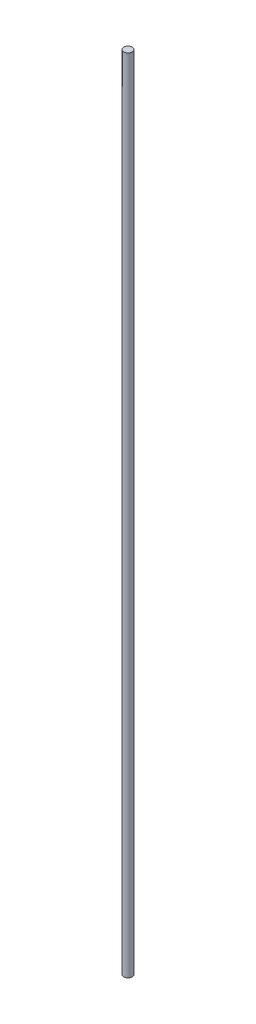
ISO-10303-21;
HEADER;
FILE_DESCRIPTION(('STEP AP214'),'2;1');
FILE_NAME('part.step','',(''),(''),'','','');
FILE_SCHEMA(('AUTOMOTIVE_DESIGN { 1 0 10303 214 1 1 1 1 }'));
ENDSEC;
DATA;
#1=APPLICATION_CONTEXT('core data for automotive mechanical design processes');
#2=APPLICATION_PROTOCOL_DEFINITION('international standard','automotive_design',2000,#1);
#3=PRODUCT_CONTEXT('',#1,'mechanical');
#4=PRODUCT('Part','Part','',(#3));
#5=PRODUCT_RELATED_PRODUCT_CATEGORY('part','',(#4));
#6=PRODUCT_DEFINITION_FORMATION('','',#4);
#7=PRODUCT_DEFINITION_CONTEXT('part definition',#1,'design');
#8=PRODUCT_DEFINITION('design','',#6,#7);
#9=PRODUCT_DEFINITION_SHAPE('','',#8);
#10=(LENGTH_UNIT() NAMED_UNIT(*) SI_UNIT(.MILLI.,.METRE.));
#11=(NAMED_UNIT(*) PLANE_ANGLE_UNIT() SI_UNIT($,.RADIAN.));
#12=(NAMED_UNIT(*) SI_UNIT($,.STERADIAN.) SOLID_ANGLE_UNIT());
#13=UNCERTAINTY_MEASURE_WITH_UNIT(LENGTH_MEASURE(1.E-05),#10,'distance_accuracy_value','');
#14=(GEOMETRIC_REPRESENTATION_CONTEXT(3) GLOBAL_UNCERTAINTY_ASSIGNED_CONTEXT((#13)) GLOBAL_UNIT_ASSIGNED_CONTEXT((#10,
#11,#12)) REPRESENTATION_CONTEXT('',''));
#15=CARTESIAN_POINT('',(0.,0.,0.));
#16=DIRECTION('',(0.,0.,1.));
#17=DIRECTION('',(1.,0.,0.));
#18=AXIS2_PLACEMENT_3D('',#15,#16,#17);
#19=CARTESIAN_POINT('',(0.,150.,0.));
#20=DIRECTION('',(0.,-1.,0.));
#21=DIRECTION('',(0.,0.,-1.));
#22=AXIS2_PLACEMENT_3D('',#19,#20,#21);
#23=CYLINDRICAL_SURFACE('',#22,1.5875);
#24=CARTESIAN_POINT('',(0.,150.,0.));
#25=DIRECTION('',(0.,1.,0.));
#26=DIRECTION('',(0.,0.,1.));
#27=AXIS2_PLACEMENT_3D('',#24,#25,#26);
#28=CIRCLE('',#27,1.5875);
#29=CARTESIAN_POINT('',(0.,150.,1.5875));
#30=VERTEX_POINT('',#29);
#31=EDGE_CURVE('E10',#30,#30,#28,.T.);
#32=ORIENTED_EDGE('',*,*,#31,.F.);
#33=EDGE_LOOP('',(#32));
#34=FACE_BOUND('',#33,.T.);
#35=CARTESIAN_POINT('',(0.,-150.,0.));
#36=DIRECTION('',(0.,1.,0.));
#37=DIRECTION('',(0.,0.,1.));
#38=AXIS2_PLACEMENT_3D('',#35,#36,#37);
#39=CIRCLE('',#38,1.5875);
#40=CARTESIAN_POINT('',(0.,-150.,1.5875));
#41=VERTEX_POINT('',#40);
#42=EDGE_CURVE('E40',#41,#41,#39,.T.);
#43=ORIENTED_EDGE('',*,*,#42,.T.);
#44=EDGE_LOOP('',(#43));
#45=FACE_BOUND('',#44,.T.);
#46=ADVANCED_FACE('F37',(#34,#45),#23,.T.);
#47=CARTESIAN_POINT('',(0.,150.,0.));
#48=DIRECTION('',(0.,1.,0.));
#49=DIRECTION('',(0.,0.,1.));
#50=AXIS2_PLACEMENT_3D('',#47,#48,#49);
#51=PLANE('',#50);
#52=ORIENTED_EDGE('',*,*,#31,.T.);
#53=EDGE_LOOP('',(#52));
#54=FACE_BOUND('',#53,.T.);
#55=ADVANCED_FACE('F52',(#54),#51,.T.);
#56=CARTESIAN_POINT('',(0.,-150.,0.));
#57=DIRECTION('',(0.,1.,0.));
#58=DIRECTION('',(0.,0.,1.));
#59=AXIS2_PLACEMENT_3D('',#56,#57,#58);
#60=PLANE('',#59);
#61=ORIENTED_EDGE('',*,*,#42,.F.);
#62=EDGE_LOOP('',(#61));
#63=FACE_BOUND('',#62,.T.);
#64=ADVANCED_FACE('F50',(#63),#60,.F.);
#65=CLOSED_SHELL('',(#46,#55,#64));
#66=MANIFOLD_SOLID_BREP('B2',#65);
#67=ADVANCED_BREP_SHAPE_REPRESENTATION('',(#18,#66),#14);
#68=SHAPE_DEFINITION_REPRESENTATION(#9,#67);
ENDSEC;
END-ISO-10303-21;
